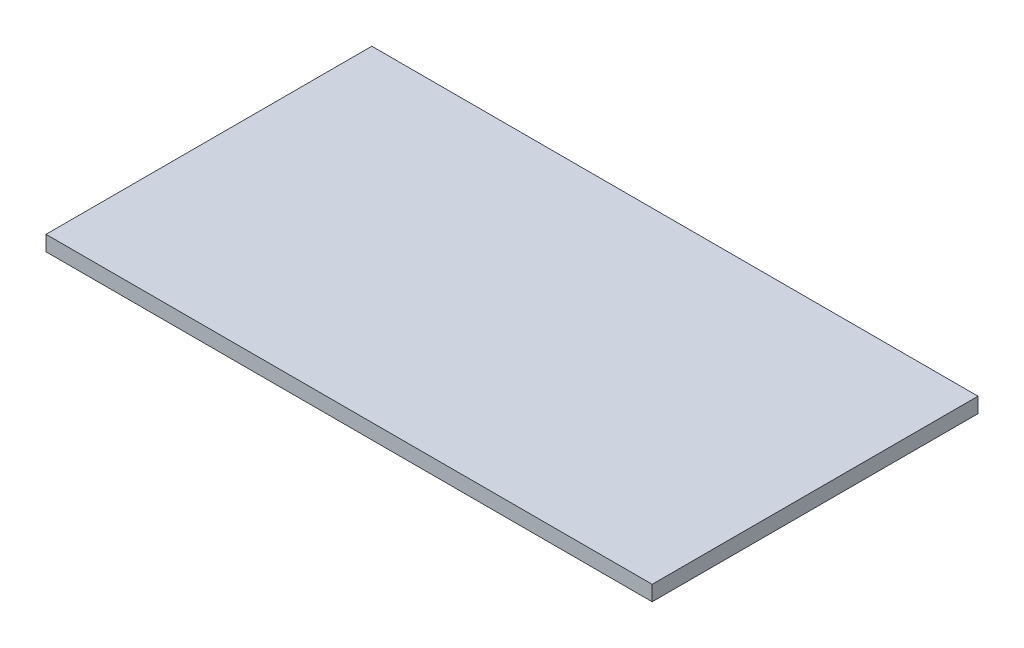
ISO-10303-21;
HEADER;
FILE_DESCRIPTION(('STEP AP214'),'2;1');
FILE_NAME('part.step','',(''),(''),'','','');
FILE_SCHEMA(('AUTOMOTIVE_DESIGN { 1 0 10303 214 1 1 1 1 }'));
ENDSEC;
DATA;
#1=APPLICATION_CONTEXT('core data for automotive mechanical design processes');
#2=APPLICATION_PROTOCOL_DEFINITION('international standard','automotive_design',2000,#1);
#3=PRODUCT_CONTEXT('',#1,'mechanical');
#4=PRODUCT('Part','Part','',(#3));
#5=PRODUCT_RELATED_PRODUCT_CATEGORY('part','',(#4));
#6=PRODUCT_DEFINITION_FORMATION('','',#4);
#7=PRODUCT_DEFINITION_CONTEXT('part definition',#1,'design');
#8=PRODUCT_DEFINITION('design','',#6,#7);
#9=PRODUCT_DEFINITION_SHAPE('','',#8);
#10=(LENGTH_UNIT() NAMED_UNIT(*) SI_UNIT(.MILLI.,.METRE.));
#11=(NAMED_UNIT(*) PLANE_ANGLE_UNIT() SI_UNIT($,.RADIAN.));
#12=(NAMED_UNIT(*) SI_UNIT($,.STERADIAN.) SOLID_ANGLE_UNIT());
#13=UNCERTAINTY_MEASURE_WITH_UNIT(LENGTH_MEASURE(1.E-05),#10,'distance_accuracy_value','');
#14=(GEOMETRIC_REPRESENTATION_CONTEXT(3) GLOBAL_UNCERTAINTY_ASSIGNED_CONTEXT((#13)) GLOBAL_UNIT_ASSIGNED_CONTEXT((#10,
#11,#12)) REPRESENTATION_CONTEXT('',''));
#15=CARTESIAN_POINT('',(0.,0.,0.));
#16=DIRECTION('',(0.,0.,1.));
#17=DIRECTION('',(1.,0.,0.));
#18=AXIS2_PLACEMENT_3D('',#15,#16,#17);
#19=CARTESIAN_POINT('',(40.,2.,-21.5));
#20=DIRECTION('',(-1.,0.,0.));
#21=DIRECTION('',(0.,0.,1.));
#22=AXIS2_PLACEMENT_3D('',#19,#20,#21);
#23=PLANE('',#22);
#24=DIRECTION('',(0.,0.,-1.));
#25=VECTOR('',#24,1.);
#26=CARTESIAN_POINT('',(40.,0.,-21.5));
#27=LINE('',#26,#25);
#28=CARTESIAN_POINT('',(40.,0.,21.5));
#29=VERTEX_POINT('',#28);
#30=CARTESIAN_POINT('',(40.,0.,-21.5));
#31=VERTEX_POINT('',#30);
#32=EDGE_CURVE('E96',#29,#31,#27,.T.);
#33=ORIENTED_EDGE('',*,*,#32,.T.);
#34=DIRECTION('',(0.,-1.,0.));
#35=VECTOR('',#34,1.);
#36=CARTESIAN_POINT('',(40.,2.,-21.5));
#37=LINE('',#36,#35);
#38=CARTESIAN_POINT('',(40.,2.,-21.5));
#39=VERTEX_POINT('',#38);
#40=EDGE_CURVE('E11',#39,#31,#37,.T.);
#41=ORIENTED_EDGE('',*,*,#40,.F.);
#42=DIRECTION('',(0.,0.,-1.));
#43=VECTOR('',#42,1.);
#44=CARTESIAN_POINT('',(40.,2.,-21.5));
#45=LINE('',#44,#43);
#46=CARTESIAN_POINT('',(40.,2.,21.5));
#47=VERTEX_POINT('',#46);
#48=EDGE_CURVE('E84',#47,#39,#45,.T.);
#49=ORIENTED_EDGE('',*,*,#48,.F.);
#50=DIRECTION('',(0.,-1.,0.));
#51=VECTOR('',#50,1.);
#52=CARTESIAN_POINT('',(40.,2.,21.5));
#53=LINE('',#52,#51);
#54=EDGE_CURVE('E92',#47,#29,#53,.T.);
#55=ORIENTED_EDGE('',*,*,#54,.T.);
#56=EDGE_LOOP('',(#33,#41,#49,#55));
#57=FACE_BOUND('',#56,.T.);
#58=ADVANCED_FACE('F33',(#57),#23,.F.);
#59=CARTESIAN_POINT('',(-40.,2.,-21.5));
#60=DIRECTION('',(0.,0.,1.));
#61=DIRECTION('',(1.,0.,0.));
#62=AXIS2_PLACEMENT_3D('',#59,#60,#61);
#63=PLANE('',#62);
#64=DIRECTION('',(-1.,0.,0.));
#65=VECTOR('',#64,1.);
#66=CARTESIAN_POINT('',(-40.,0.,-21.5));
#67=LINE('',#66,#65);
#68=CARTESIAN_POINT('',(-40.,0.,-21.5));
#69=VERTEX_POINT('',#68);
#70=EDGE_CURVE('E88',#31,#69,#67,.T.);
#71=ORIENTED_EDGE('',*,*,#70,.T.);
#72=DIRECTION('',(0.,-1.,0.));
#73=VECTOR('',#72,1.);
#74=CARTESIAN_POINT('',(-40.,2.,-21.5));
#75=LINE('',#74,#73);
#76=CARTESIAN_POINT('',(-40.,2.,-21.5));
#77=VERTEX_POINT('',#76);
#78=EDGE_CURVE('E41',#77,#69,#75,.T.);
#79=ORIENTED_EDGE('',*,*,#78,.F.);
#80=DIRECTION('',(-1.,0.,0.));
#81=VECTOR('',#80,1.);
#82=CARTESIAN_POINT('',(-40.,2.,-21.5));
#83=LINE('',#82,#81);
#84=EDGE_CURVE('E79',#39,#77,#83,.T.);
#85=ORIENTED_EDGE('',*,*,#84,.F.);
#86=ORIENTED_EDGE('',*,*,#40,.T.);
#87=EDGE_LOOP('',(#71,#79,#85,#86));
#88=FACE_BOUND('',#87,.T.);
#89=ADVANCED_FACE('F87',(#88),#63,.F.);
#90=CARTESIAN_POINT('',(-40.,2.,-21.5));
#91=DIRECTION('',(1.,0.,0.));
#92=DIRECTION('',(0.,0.,-1.));
#93=AXIS2_PLACEMENT_3D('',#90,#91,#92);
#94=PLANE('',#93);
#95=DIRECTION('',(0.,0.,1.));
#96=VECTOR('',#95,1.);
#97=CARTESIAN_POINT('',(-40.,0.,-21.5));
#98=LINE('',#97,#96);
#99=CARTESIAN_POINT('',(-40.,0.,21.5));
#100=VERTEX_POINT('',#99);
#101=EDGE_CURVE('E66',#69,#100,#98,.T.);
#102=ORIENTED_EDGE('',*,*,#101,.T.);
#103=DIRECTION('',(0.,-1.,0.));
#104=VECTOR('',#103,1.);
#105=CARTESIAN_POINT('',(-40.,2.,21.5));
#106=LINE('',#105,#104);
#107=CARTESIAN_POINT('',(-40.,2.,21.5));
#108=VERTEX_POINT('',#107);
#109=EDGE_CURVE('E89',#108,#100,#106,.T.);
#110=ORIENTED_EDGE('',*,*,#109,.F.);
#111=DIRECTION('',(0.,0.,1.));
#112=VECTOR('',#111,1.);
#113=CARTESIAN_POINT('',(-40.,2.,-21.5));
#114=LINE('',#113,#112);
#115=EDGE_CURVE('E82',#77,#108,#114,.T.);
#116=ORIENTED_EDGE('',*,*,#115,.F.);
#117=ORIENTED_EDGE('',*,*,#78,.T.);
#118=EDGE_LOOP('',(#102,#110,#116,#117));
#119=FACE_BOUND('',#118,.T.);
#120=ADVANCED_FACE('F90',(#119),#94,.F.);
#121=CARTESIAN_POINT('',(-40.,2.,21.5));
#122=DIRECTION('',(0.,0.,-1.));
#123=DIRECTION('',(-1.,0.,0.));
#124=AXIS2_PLACEMENT_3D('',#121,#122,#123);
#125=PLANE('',#124);
#126=DIRECTION('',(1.,0.,0.));
#127=VECTOR('',#126,1.);
#128=CARTESIAN_POINT('',(-40.,0.,21.5));
#129=LINE('',#128,#127);
#130=EDGE_CURVE('E72',#100,#29,#129,.T.);
#131=ORIENTED_EDGE('',*,*,#130,.T.);
#132=ORIENTED_EDGE('',*,*,#54,.F.);
#133=DIRECTION('',(1.,0.,0.));
#134=VECTOR('',#133,1.);
#135=CARTESIAN_POINT('',(-40.,2.,21.5));
#136=LINE('',#135,#134);
#137=EDGE_CURVE('E49',#108,#47,#136,.T.);
#138=ORIENTED_EDGE('',*,*,#137,.F.);
#139=ORIENTED_EDGE('',*,*,#109,.T.);
#140=EDGE_LOOP('',(#131,#132,#138,#139));
#141=FACE_BOUND('',#140,.T.);
#142=ADVANCED_FACE('F103',(#141),#125,.F.);
#143=CARTESIAN_POINT('',(0.,2.,0.));
#144=DIRECTION('',(0.,1.,0.));
#145=DIRECTION('',(0.,0.,1.));
#146=AXIS2_PLACEMENT_3D('',#143,#144,#145);
#147=PLANE('',#146);
#148=ORIENTED_EDGE('',*,*,#48,.T.);
#149=ORIENTED_EDGE('',*,*,#84,.T.);
#150=ORIENTED_EDGE('',*,*,#115,.T.);
#151=ORIENTED_EDGE('',*,*,#137,.T.);
#152=EDGE_LOOP('',(#148,#149,#150,#151));
#153=FACE_BOUND('',#152,.T.);
#154=ADVANCED_FACE('F80',(#153),#147,.T.);
#155=CARTESIAN_POINT('',(0.,0.,0.));
#156=DIRECTION('',(0.,1.,0.));
#157=DIRECTION('',(0.,0.,1.));
#158=AXIS2_PLACEMENT_3D('',#155,#156,#157);
#159=PLANE('',#158);
#160=ORIENTED_EDGE('',*,*,#32,.F.);
#161=ORIENTED_EDGE('',*,*,#130,.F.);
#162=ORIENTED_EDGE('',*,*,#101,.F.);
#163=ORIENTED_EDGE('',*,*,#70,.F.);
#164=EDGE_LOOP('',(#160,#161,#162,#163));
#165=FACE_BOUND('',#164,.T.);
#166=ADVANCED_FACE('F106',(#165),#159,.F.);
#167=CLOSED_SHELL('',(#58,#89,#120,#142,#154,#166));
#168=MANIFOLD_SOLID_BREP('B2',#167);
#169=ADVANCED_BREP_SHAPE_REPRESENTATION('',(#18,#168),#14);
#170=SHAPE_DEFINITION_REPRESENTATION(#9,#169);
ENDSEC;
END-ISO-10303-21;
